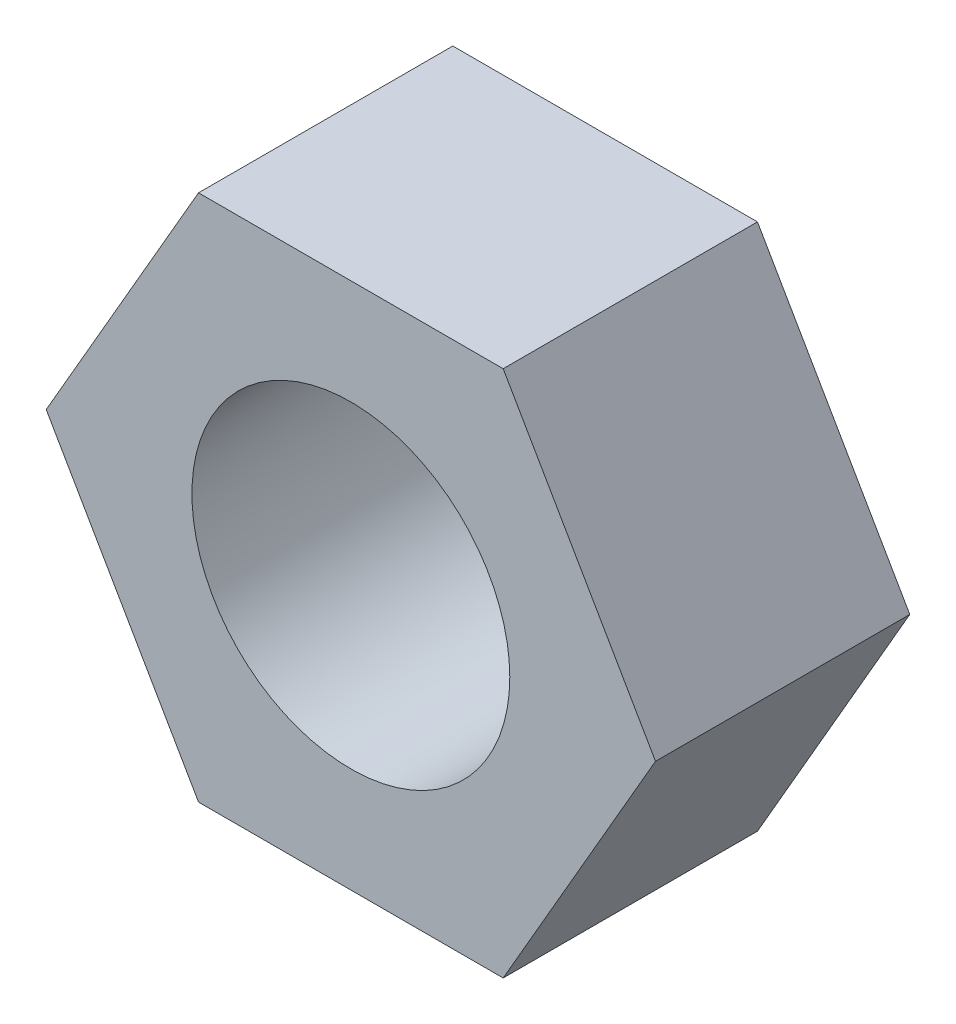
ISO-10303-21;
HEADER;
FILE_DESCRIPTION(('STEP AP214'),'2;1');
FILE_NAME('part.step','',(''),(''),'','','');
FILE_SCHEMA(('AUTOMOTIVE_DESIGN { 1 0 10303 214 1 1 1 1 }'));
ENDSEC;
DATA;
#1=APPLICATION_CONTEXT('core data for automotive mechanical design processes');
#2=APPLICATION_PROTOCOL_DEFINITION('international standard','automotive_design',2000,#1);
#3=PRODUCT_CONTEXT('',#1,'mechanical');
#4=PRODUCT('Part','Part','',(#3));
#5=PRODUCT_RELATED_PRODUCT_CATEGORY('part','',(#4));
#6=PRODUCT_DEFINITION_FORMATION('','',#4);
#7=PRODUCT_DEFINITION_CONTEXT('part definition',#1,'design');
#8=PRODUCT_DEFINITION('design','',#6,#7);
#9=PRODUCT_DEFINITION_SHAPE('','',#8);
#10=(LENGTH_UNIT() NAMED_UNIT(*) SI_UNIT(.MILLI.,.METRE.));
#11=(NAMED_UNIT(*) PLANE_ANGLE_UNIT() SI_UNIT($,.RADIAN.));
#12=(NAMED_UNIT(*) SI_UNIT($,.STERADIAN.) SOLID_ANGLE_UNIT());
#13=UNCERTAINTY_MEASURE_WITH_UNIT(LENGTH_MEASURE(1.E-05),#10,'distance_accuracy_value','');
#14=(GEOMETRIC_REPRESENTATION_CONTEXT(3) GLOBAL_UNCERTAINTY_ASSIGNED_CONTEXT((#13)) GLOBAL_UNIT_ASSIGNED_CONTEXT((#10,
#11,#12)) REPRESENTATION_CONTEXT('',''));
#15=CARTESIAN_POINT('',(0.,0.,0.));
#16=DIRECTION('',(0.,0.,1.));
#17=DIRECTION('',(1.,0.,0.));
#18=AXIS2_PLACEMENT_3D('',#15,#16,#17);
#19=CARTESIAN_POINT('',(2.39600361713695,-4.15,4.));
#20=DIRECTION('',(-0.866025403784439,0.5,0.));
#21=DIRECTION('',(-0.5,-0.866025403784439,0.));
#22=AXIS2_PLACEMENT_3D('',#19,#20,#21);
#23=PLANE('',#22);
#24=DIRECTION('',(0.5,0.866025403784439,0.));
#25=VECTOR('',#24,1.);
#26=CARTESIAN_POINT('',(2.39600361713695,-4.15,0.));
#27=LINE('',#26,#25);
#28=CARTESIAN_POINT('',(2.39600361713695,-4.15,0.));
#29=VERTEX_POINT('',#28);
#30=CARTESIAN_POINT('',(4.79200723427389,0.,0.));
#31=VERTEX_POINT('',#30);
#32=EDGE_CURVE('E128',#29,#31,#27,.T.);
#33=ORIENTED_EDGE('',*,*,#32,.T.);
#34=DIRECTION('',(0.,0.,-1.));
#35=VECTOR('',#34,1.);
#36=CARTESIAN_POINT('',(4.79200723427389,0.,4.));
#37=LINE('',#36,#35);
#38=CARTESIAN_POINT('',(4.79200723427389,0.,4.));
#39=VERTEX_POINT('',#38);
#40=EDGE_CURVE('E11',#39,#31,#37,.T.);
#41=ORIENTED_EDGE('',*,*,#40,.F.);
#42=DIRECTION('',(0.5,0.866025403784439,0.));
#43=VECTOR('',#42,1.);
#44=CARTESIAN_POINT('',(2.39600361713695,-4.15,4.));
#45=LINE('',#44,#43);
#46=CARTESIAN_POINT('',(2.39600361713695,-4.15,4.));
#47=VERTEX_POINT('',#46);
#48=EDGE_CURVE('E138',#47,#39,#45,.T.);
#49=ORIENTED_EDGE('',*,*,#48,.F.);
#50=DIRECTION('',(0.,0.,-1.));
#51=VECTOR('',#50,1.);
#52=CARTESIAN_POINT('',(2.39600361713695,-4.15,4.));
#53=LINE('',#52,#51);
#54=EDGE_CURVE('E124',#47,#29,#53,.T.);
#55=ORIENTED_EDGE('',*,*,#54,.T.);
#56=EDGE_LOOP('',(#33,#41,#49,#55));
#57=FACE_BOUND('',#56,.T.);
#58=ADVANCED_FACE('F43',(#57),#23,.F.);
#59=CARTESIAN_POINT('',(4.79200723427389,0.,4.));
#60=DIRECTION('',(-0.866025403784439,-0.5,0.));
#61=DIRECTION('',(0.5,-0.866025403784439,0.));
#62=AXIS2_PLACEMENT_3D('',#59,#60,#61);
#63=PLANE('',#62);
#64=DIRECTION('',(-0.5,0.866025403784439,0.));
#65=VECTOR('',#64,1.);
#66=CARTESIAN_POINT('',(4.79200723427389,0.,0.));
#67=LINE('',#66,#65);
#68=CARTESIAN_POINT('',(2.39600361713695,4.15,0.));
#69=VERTEX_POINT('',#68);
#70=EDGE_CURVE('E131',#31,#69,#67,.T.);
#71=ORIENTED_EDGE('',*,*,#70,.T.);
#72=DIRECTION('',(0.,0.,-1.));
#73=VECTOR('',#72,1.);
#74=CARTESIAN_POINT('',(2.39600361713695,4.15,4.));
#75=LINE('',#74,#73);
#76=CARTESIAN_POINT('',(2.39600361713695,4.15,4.));
#77=VERTEX_POINT('',#76);
#78=EDGE_CURVE('E52',#77,#69,#75,.T.);
#79=ORIENTED_EDGE('',*,*,#78,.F.);
#80=DIRECTION('',(-0.5,0.866025403784439,0.));
#81=VECTOR('',#80,1.);
#82=CARTESIAN_POINT('',(4.79200723427389,0.,4.));
#83=LINE('',#82,#81);
#84=EDGE_CURVE('E97',#39,#77,#83,.T.);
#85=ORIENTED_EDGE('',*,*,#84,.F.);
#86=ORIENTED_EDGE('',*,*,#40,.T.);
#87=EDGE_LOOP('',(#71,#79,#85,#86));
#88=FACE_BOUND('',#87,.T.);
#89=ADVANCED_FACE('F164',(#88),#63,.F.);
#90=CARTESIAN_POINT('',(2.39600361713695,4.15,4.));
#91=DIRECTION('',(0.,-1.,0.));
#92=DIRECTION('',(0.,0.,-1.));
#93=AXIS2_PLACEMENT_3D('',#90,#91,#92);
#94=PLANE('',#93);
#95=DIRECTION('',(-1.,0.,0.));
#96=VECTOR('',#95,1.);
#97=CARTESIAN_POINT('',(2.39600361713695,4.15,0.));
#98=LINE('',#97,#96);
#99=CARTESIAN_POINT('',(-2.39600361713695,4.15,0.));
#100=VERTEX_POINT('',#99);
#101=EDGE_CURVE('E133',#69,#100,#98,.T.);
#102=ORIENTED_EDGE('',*,*,#101,.T.);
#103=DIRECTION('',(0.,0.,-1.));
#104=VECTOR('',#103,1.);
#105=CARTESIAN_POINT('',(-2.39600361713695,4.15,4.));
#106=LINE('',#105,#104);
#107=CARTESIAN_POINT('',(-2.39600361713695,4.15,4.));
#108=VERTEX_POINT('',#107);
#109=EDGE_CURVE('E119',#108,#100,#106,.T.);
#110=ORIENTED_EDGE('',*,*,#109,.F.);
#111=DIRECTION('',(-1.,0.,0.));
#112=VECTOR('',#111,1.);
#113=CARTESIAN_POINT('',(2.39600361713695,4.15,4.));
#114=LINE('',#113,#112);
#115=EDGE_CURVE('E110',#77,#108,#114,.T.);
#116=ORIENTED_EDGE('',*,*,#115,.F.);
#117=ORIENTED_EDGE('',*,*,#78,.T.);
#118=EDGE_LOOP('',(#102,#110,#116,#117));
#119=FACE_BOUND('',#118,.T.);
#120=ADVANCED_FACE('F145',(#119),#94,.F.);
#121=CARTESIAN_POINT('',(-2.39600361713695,4.15,4.));
#122=DIRECTION('',(0.866025403784439,-0.5,0.));
#123=DIRECTION('',(0.5,0.866025403784439,0.));
#124=AXIS2_PLACEMENT_3D('',#121,#122,#123);
#125=PLANE('',#124);
#126=DIRECTION('',(-0.5,-0.866025403784439,0.));
#127=VECTOR('',#126,1.);
#128=CARTESIAN_POINT('',(-2.39600361713695,4.15,0.));
#129=LINE('',#128,#127);
#130=CARTESIAN_POINT('',(-4.79200723427389,0.,0.));
#131=VERTEX_POINT('',#130);
#132=EDGE_CURVE('E118',#100,#131,#129,.T.);
#133=ORIENTED_EDGE('',*,*,#132,.T.);
#134=DIRECTION('',(0.,0.,-1.));
#135=VECTOR('',#134,1.);
#136=CARTESIAN_POINT('',(-4.79200723427389,0.,4.));
#137=LINE('',#136,#135);
#138=CARTESIAN_POINT('',(-4.79200723427389,0.,4.));
#139=VERTEX_POINT('',#138);
#140=EDGE_CURVE('E115',#139,#131,#137,.T.);
#141=ORIENTED_EDGE('',*,*,#140,.F.);
#142=DIRECTION('',(-0.5,-0.866025403784439,0.));
#143=VECTOR('',#142,1.);
#144=CARTESIAN_POINT('',(-2.39600361713695,4.15,4.));
#145=LINE('',#144,#143);
#146=EDGE_CURVE('E104',#108,#139,#145,.T.);
#147=ORIENTED_EDGE('',*,*,#146,.F.);
#148=ORIENTED_EDGE('',*,*,#109,.T.);
#149=EDGE_LOOP('',(#133,#141,#147,#148));
#150=FACE_BOUND('',#149,.T.);
#151=ADVANCED_FACE('F116',(#150),#125,.F.);
#152=CARTESIAN_POINT('',(-4.79200723427389,0.,4.));
#153=DIRECTION('',(0.866025403784439,0.5,0.));
#154=DIRECTION('',(-0.5,0.866025403784439,0.));
#155=AXIS2_PLACEMENT_3D('',#152,#153,#154);
#156=PLANE('',#155);
#157=DIRECTION('',(0.5,-0.866025403784439,0.));
#158=VECTOR('',#157,1.);
#159=CARTESIAN_POINT('',(-4.79200723427389,0.,0.));
#160=LINE('',#159,#158);
#161=CARTESIAN_POINT('',(-2.39600361713695,-4.15,0.));
#162=VERTEX_POINT('',#161);
#163=EDGE_CURVE('E83',#131,#162,#160,.T.);
#164=ORIENTED_EDGE('',*,*,#163,.T.);
#165=DIRECTION('',(0.,0.,-1.));
#166=VECTOR('',#165,1.);
#167=CARTESIAN_POINT('',(-2.39600361713695,-4.15,4.));
#168=LINE('',#167,#166);
#169=CARTESIAN_POINT('',(-2.39600361713695,-4.15,4.));
#170=VERTEX_POINT('',#169);
#171=EDGE_CURVE('E120',#170,#162,#168,.T.);
#172=ORIENTED_EDGE('',*,*,#171,.F.);
#173=DIRECTION('',(0.5,-0.866025403784439,0.));
#174=VECTOR('',#173,1.);
#175=CARTESIAN_POINT('',(-4.79200723427389,0.,4.));
#176=LINE('',#175,#174);
#177=EDGE_CURVE('E108',#139,#170,#176,.T.);
#178=ORIENTED_EDGE('',*,*,#177,.F.);
#179=ORIENTED_EDGE('',*,*,#140,.T.);
#180=EDGE_LOOP('',(#164,#172,#178,#179));
#181=FACE_BOUND('',#180,.T.);
#182=ADVANCED_FACE('F122',(#181),#156,.F.);
#183=CARTESIAN_POINT('',(-2.39600361713695,-4.15,4.));
#184=DIRECTION('',(0.,1.,0.));
#185=DIRECTION('',(0.,0.,1.));
#186=AXIS2_PLACEMENT_3D('',#183,#184,#185);
#187=PLANE('',#186);
#188=DIRECTION('',(1.,0.,0.));
#189=VECTOR('',#188,1.);
#190=CARTESIAN_POINT('',(-2.39600361713695,-4.15,0.));
#191=LINE('',#190,#189);
#192=EDGE_CURVE('E89',#162,#29,#191,.T.);
#193=ORIENTED_EDGE('',*,*,#192,.T.);
#194=ORIENTED_EDGE('',*,*,#54,.F.);
#195=DIRECTION('',(1.,0.,0.));
#196=VECTOR('',#195,1.);
#197=CARTESIAN_POINT('',(-2.39600361713695,-4.15,4.));
#198=LINE('',#197,#196);
#199=EDGE_CURVE('E60',#170,#47,#198,.T.);
#200=ORIENTED_EDGE('',*,*,#199,.F.);
#201=ORIENTED_EDGE('',*,*,#171,.T.);
#202=EDGE_LOOP('',(#193,#194,#200,#201));
#203=FACE_BOUND('',#202,.T.);
#204=ADVANCED_FACE('F152',(#203),#187,.F.);
#205=CARTESIAN_POINT('',(0.,0.,4.));
#206=DIRECTION('',(0.,0.,1.));
#207=DIRECTION('',(1.,0.,0.));
#208=AXIS2_PLACEMENT_3D('',#205,#206,#207);
#209=PLANE('',#208);
#210=CARTESIAN_POINT('',(0.,0.,4.));
#211=DIRECTION('',(0.,0.,1.));
#212=DIRECTION('',(1.,0.,0.));
#213=AXIS2_PLACEMENT_3D('',#210,#211,#212);
#214=CIRCLE('',#213,2.5);
#215=CARTESIAN_POINT('',(2.5,0.,4.));
#216=VERTEX_POINT('',#215);
#217=EDGE_CURVE('E220',#216,#216,#214,.T.);
#218=ORIENTED_EDGE('',*,*,#217,.F.);
#219=EDGE_LOOP('',(#218));
#220=FACE_BOUND('',#219,.T.);
#221=ORIENTED_EDGE('',*,*,#48,.T.);
#222=ORIENTED_EDGE('',*,*,#84,.T.);
#223=ORIENTED_EDGE('',*,*,#115,.T.);
#224=ORIENTED_EDGE('',*,*,#146,.T.);
#225=ORIENTED_EDGE('',*,*,#177,.T.);
#226=ORIENTED_EDGE('',*,*,#199,.T.);
#227=EDGE_LOOP('',(#221,#222,#223,#224,#225,#226));
#228=FACE_BOUND('',#227,.T.);
#229=ADVANCED_FACE('F106',(#220,#228),#209,.T.);
#230=CARTESIAN_POINT('',(0.,0.,0.));
#231=DIRECTION('',(0.,0.,1.));
#232=DIRECTION('',(1.,0.,0.));
#233=AXIS2_PLACEMENT_3D('',#230,#231,#232);
#234=PLANE('',#233);
#235=CARTESIAN_POINT('',(0.,0.,0.));
#236=DIRECTION('',(0.,0.,1.));
#237=DIRECTION('',(1.,0.,0.));
#238=AXIS2_PLACEMENT_3D('',#235,#236,#237);
#239=CIRCLE('',#238,2.5);
#240=CARTESIAN_POINT('',(2.5,0.,0.));
#241=VERTEX_POINT('',#240);
#242=EDGE_CURVE('E46',#241,#241,#239,.T.);
#243=ORIENTED_EDGE('',*,*,#242,.T.);
#244=EDGE_LOOP('',(#243));
#245=FACE_BOUND('',#244,.T.);
#246=ORIENTED_EDGE('',*,*,#32,.F.);
#247=ORIENTED_EDGE('',*,*,#192,.F.);
#248=ORIENTED_EDGE('',*,*,#163,.F.);
#249=ORIENTED_EDGE('',*,*,#132,.F.);
#250=ORIENTED_EDGE('',*,*,#101,.F.);
#251=ORIENTED_EDGE('',*,*,#70,.F.);
#252=EDGE_LOOP('',(#246,#247,#248,#249,#250,#251));
#253=FACE_BOUND('',#252,.T.);
#254=ADVANCED_FACE('F148',(#245,#253),#234,.F.);
#255=CARTESIAN_POINT('',(0.,0.,-1.2E-05));
#256=DIRECTION('',(0.,0.,1.));
#257=DIRECTION('',(1.,0.,0.));
#258=AXIS2_PLACEMENT_3D('',#255,#256,#257);
#259=CYLINDRICAL_SURFACE('',#258,2.5);
#260=CARTESIAN_POINT('',(2.5,0.,4.));
#261=CARTESIAN_POINT('',(2.5,0.,3.95833333333333));
#262=CARTESIAN_POINT('',(2.5,0.,3.91666666666667));
#263=CARTESIAN_POINT('',(2.5,0.,3.83333333333333));
#264=CARTESIAN_POINT('',(2.5,0.,3.79166666666667));
#265=CARTESIAN_POINT('',(2.5,0.,3.70833333333333));
#266=CARTESIAN_POINT('',(2.5,0.,3.66666666666667));
#267=CARTESIAN_POINT('',(2.5,0.,3.58333333333333));
#268=CARTESIAN_POINT('',(2.5,0.,3.54166666666667));
#269=CARTESIAN_POINT('',(2.5,0.,3.45833333333333));
#270=CARTESIAN_POINT('',(2.5,0.,3.41666666666667));
#271=CARTESIAN_POINT('',(2.5,0.,3.33333333333333));
#272=CARTESIAN_POINT('',(2.5,0.,3.29166666666667));
#273=CARTESIAN_POINT('',(2.5,0.,3.20833333333333));
#274=CARTESIAN_POINT('',(2.5,0.,3.16666666666667));
#275=CARTESIAN_POINT('',(2.5,0.,3.08333333333333));
#276=CARTESIAN_POINT('',(2.5,0.,3.04166666666667));
#277=CARTESIAN_POINT('',(2.5,0.,2.95833333333333));
#278=CARTESIAN_POINT('',(2.5,0.,2.91666666666667));
#279=CARTESIAN_POINT('',(2.5,0.,2.83333333333333));
#280=CARTESIAN_POINT('',(2.5,0.,2.79166666666667));
#281=CARTESIAN_POINT('',(2.5,0.,2.70833333333333));
#282=CARTESIAN_POINT('',(2.5,0.,2.66666666666667));
#283=CARTESIAN_POINT('',(2.5,0.,2.58333333333333));
#284=CARTESIAN_POINT('',(2.5,0.,2.54166666666667));
#285=CARTESIAN_POINT('',(2.5,0.,2.45833333333333));
#286=CARTESIAN_POINT('',(2.5,0.,2.41666666666667));
#287=CARTESIAN_POINT('',(2.5,0.,2.33333333333333));
#288=CARTESIAN_POINT('',(2.5,0.,2.29166666666667));
#289=CARTESIAN_POINT('',(2.5,0.,2.20833333333333));
#290=CARTESIAN_POINT('',(2.5,0.,2.16666666666667));
#291=CARTESIAN_POINT('',(2.5,0.,2.08333333333333));
#292=CARTESIAN_POINT('',(2.5,0.,2.04166666666667));
#293=CARTESIAN_POINT('',(2.5,0.,1.95833333333333));
#294=CARTESIAN_POINT('',(2.5,0.,1.91666666666667));
#295=CARTESIAN_POINT('',(2.5,0.,1.83333333333333));
#296=CARTESIAN_POINT('',(2.5,0.,1.79166666666667));
#297=CARTESIAN_POINT('',(2.5,0.,1.70833333333333));
#298=CARTESIAN_POINT('',(2.5,0.,1.66666666666667));
#299=CARTESIAN_POINT('',(2.5,0.,1.58333333333333));
#300=CARTESIAN_POINT('',(2.5,0.,1.54166666666667));
#301=CARTESIAN_POINT('',(2.5,0.,1.45833333333333));
#302=CARTESIAN_POINT('',(2.5,0.,1.41666666666667));
#303=CARTESIAN_POINT('',(2.5,0.,1.33333333333333));
#304=CARTESIAN_POINT('',(2.5,0.,1.29166666666667));
#305=CARTESIAN_POINT('',(2.5,0.,1.20833333333333));
#306=CARTESIAN_POINT('',(2.5,0.,1.16666666666667));
#307=CARTESIAN_POINT('',(2.5,0.,1.08333333333333));
#308=CARTESIAN_POINT('',(2.5,0.,1.04166666666667));
#309=CARTESIAN_POINT('',(2.5,0.,0.958333333333333));
#310=CARTESIAN_POINT('',(2.5,0.,0.916666666666667));
#311=CARTESIAN_POINT('',(2.5,0.,0.833333333333333));
#312=CARTESIAN_POINT('',(2.5,0.,0.791666666666667));
#313=CARTESIAN_POINT('',(2.5,0.,0.708333333333333));
#314=CARTESIAN_POINT('',(2.5,0.,0.666666666666667));
#315=CARTESIAN_POINT('',(2.5,0.,0.583333333333333));
#316=CARTESIAN_POINT('',(2.5,0.,0.541666666666666));
#317=CARTESIAN_POINT('',(2.5,0.,0.458333333333333));
#318=CARTESIAN_POINT('',(2.5,0.,0.416666666666666));
#319=CARTESIAN_POINT('',(2.5,0.,0.333333333333333));
#320=CARTESIAN_POINT('',(2.5,0.,0.291666666666666));
#321=CARTESIAN_POINT('',(2.5,0.,0.208333333333333));
#322=CARTESIAN_POINT('',(2.5,0.,0.166666666666667));
#323=CARTESIAN_POINT('',(2.5,0.,0.0833333333333331));
#324=CARTESIAN_POINT('',(2.5,0.,0.0416666666666665));
#325=CARTESIAN_POINT('',(2.5,0.,0.));
#326=B_SPLINE_CURVE_WITH_KNOTS('',3,(#260,#261,#262,#263,#264,#265,#266,#267,#268,#269,#270,
#271,#272,#273,#274,#275,#276,#277,#278,#279,#280,#281,#282,#283,#284,#285,#286,#287,#288,#289,
#290,#291,#292,#293,#294,#295,#296,#297,#298,#299,#300,#301,#302,#303,#304,#305,#306,#307,#308,
#309,#310,#311,#312,#313,#314,#315,#316,#317,#318,#319,#320,#321,#322,#323,#324,#325),
.UNSPECIFIED.,.F.,.F.,(4,2,2,2,2,2,2,2,2,2,2,2,2,2,2,2,2,2,2,2,2,2,2,2,2,2,2,2,2,2,2,2,4),(0.,
0.125,0.25,0.375,0.5,0.625,0.75,0.875,1.,1.125,1.25,1.375,1.5,1.625,1.75,1.875,2.,2.125,2.25,
2.375,2.5,2.625,2.75,2.875,3.,3.125,3.25,3.375,3.5,3.625,3.75,3.875,4.),.UNSPECIFIED.);
#327=EDGE_CURVE('BSEAM203',#216,#241,#326,.T.);
#328=ORIENTED_EDGE('',*,*,#217,.T.);
#329=ORIENTED_EDGE('',*,*,#242,.F.);
#330=ORIENTED_EDGE('',*,*,#327,.T.);
#331=ORIENTED_EDGE('',*,*,#327,.F.);
#332=EDGE_LOOP('',(#328,#330,#329,#331));
#333=FACE_BOUND('',#332,.T.);
#334=ADVANCED_FACE('F203',(#333),#259,.F.);
#335=CLOSED_SHELL('',(#58,#89,#120,#151,#182,#204,#229,#254,#334));
#336=MANIFOLD_SOLID_BREP('B2',#335);
#337=ADVANCED_BREP_SHAPE_REPRESENTATION('',(#18,#336),#14);
#338=SHAPE_DEFINITION_REPRESENTATION(#9,#337);
ENDSEC;
END-ISO-10303-21;
